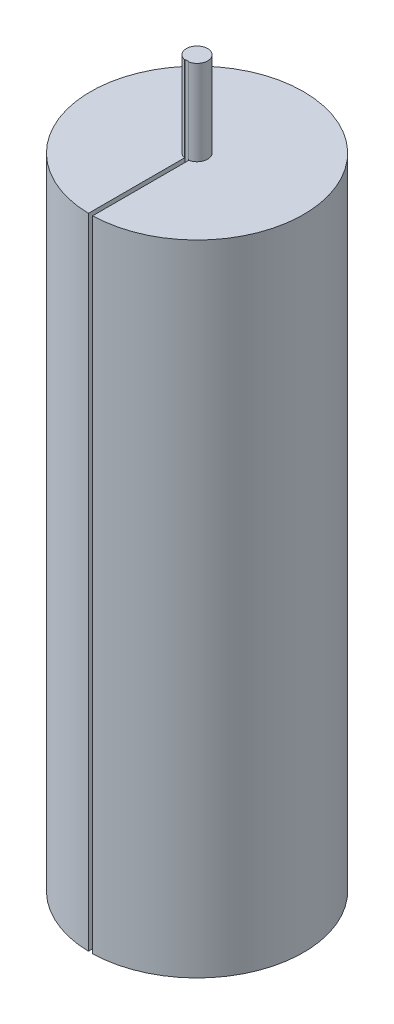
ISO-10303-21;
HEADER;
FILE_DESCRIPTION(('STEP AP214'),'2;1');
FILE_NAME('part.step','',(''),(''),'','','');
FILE_SCHEMA(('AUTOMOTIVE_DESIGN { 1 0 10303 214 1 1 1 1 }'));
ENDSEC;
DATA;
#1=APPLICATION_CONTEXT('core data for automotive mechanical design processes');
#2=APPLICATION_PROTOCOL_DEFINITION('international standard','automotive_design',2000,#1);
#3=PRODUCT_CONTEXT('',#1,'mechanical');
#4=PRODUCT('Part','Part','',(#3));
#5=PRODUCT_RELATED_PRODUCT_CATEGORY('part','',(#4));
#6=PRODUCT_DEFINITION_FORMATION('','',#4);
#7=PRODUCT_DEFINITION_CONTEXT('part definition',#1,'design');
#8=PRODUCT_DEFINITION('design','',#6,#7);
#9=PRODUCT_DEFINITION_SHAPE('','',#8);
#10=(LENGTH_UNIT() NAMED_UNIT(*) SI_UNIT(.MILLI.,.METRE.));
#11=(NAMED_UNIT(*) PLANE_ANGLE_UNIT() SI_UNIT($,.RADIAN.));
#12=(NAMED_UNIT(*) SI_UNIT($,.STERADIAN.) SOLID_ANGLE_UNIT());
#13=UNCERTAINTY_MEASURE_WITH_UNIT(LENGTH_MEASURE(1.E-05),#10,'distance_accuracy_value','');
#14=(GEOMETRIC_REPRESENTATION_CONTEXT(3) GLOBAL_UNCERTAINTY_ASSIGNED_CONTEXT((#13)) GLOBAL_UNIT_ASSIGNED_CONTEXT((#10,
#11,#12)) REPRESENTATION_CONTEXT('',''));
#15=CARTESIAN_POINT('',(0.,0.,0.));
#16=DIRECTION('',(0.,0.,1.));
#17=DIRECTION('',(1.,0.,0.));
#18=AXIS2_PLACEMENT_3D('',#15,#16,#17);
#19=CARTESIAN_POINT('',(0.,150.,0.));
#20=DIRECTION('',(0.,-1.,0.));
#21=DIRECTION('',(0.,0.,-1.));
#22=AXIS2_PLACEMENT_3D('',#19,#20,#21);
#23=CYLINDRICAL_SURFACE('',#22,25.);
#24=CARTESIAN_POINT('',(0.,0.,0.));
#25=DIRECTION('',(0.,1.,0.));
#26=DIRECTION('',(0.,0.,1.));
#27=AXIS2_PLACEMENT_3D('',#24,#25,#26);
#28=CIRCLE('',#27,25.);
#29=CARTESIAN_POINT('',(0.5,0.,24.9949994999));
#30=VERTEX_POINT('',#29);
#31=CARTESIAN_POINT('',(-0.5,0.,24.9949994999));
#32=VERTEX_POINT('',#31);
#33=EDGE_CURVE('E105',#30,#32,#28,.T.);
#34=ORIENTED_EDGE('',*,*,#33,.T.);
#35=DIRECTION('',(0.,-1.,0.));
#36=VECTOR('',#35,1.);
#37=CARTESIAN_POINT('',(-0.5,150.,24.9949994999));
#38=LINE('',#37,#36);
#39=CARTESIAN_POINT('',(-0.5,150.,24.9949994999));
#40=VERTEX_POINT('',#39);
#41=EDGE_CURVE('E110',#32,#40,#38,.F.);
#42=ORIENTED_EDGE('',*,*,#41,.T.);
#43=CARTESIAN_POINT('',(0.,150.,0.));
#44=DIRECTION('',(0.,1.,0.));
#45=DIRECTION('',(0.,0.,1.));
#46=AXIS2_PLACEMENT_3D('',#43,#44,#45);
#47=CIRCLE('',#46,25.);
#48=CARTESIAN_POINT('',(0.5,150.,24.9949994999));
#49=VERTEX_POINT('',#48);
#50=EDGE_CURVE('E39',#49,#40,#47,.T.);
#51=ORIENTED_EDGE('',*,*,#50,.F.);
#52=DIRECTION('',(0.,-1.,0.));
#53=VECTOR('',#52,1.);
#54=CARTESIAN_POINT('',(0.5,150.,24.9949994999));
#55=LINE('',#54,#53);
#56=EDGE_CURVE('E124',#49,#30,#55,.T.);
#57=ORIENTED_EDGE('',*,*,#56,.T.);
#58=EDGE_LOOP('',(#34,#42,#51,#57));
#59=FACE_BOUND('',#58,.T.);
#60=ADVANCED_FACE('F32',(#59),#23,.T.);
#61=CARTESIAN_POINT('',(0.,150.,0.));
#62=DIRECTION('',(0.,1.,0.));
#63=DIRECTION('',(0.,0.,1.));
#64=AXIS2_PLACEMENT_3D('',#61,#62,#63);
#65=PLANE('',#64);
#66=DIRECTION('',(0.,0.,1.));
#67=VECTOR('',#66,1.);
#68=CARTESIAN_POINT('',(-0.499999999999997,150.,0.));
#69=LINE('',#68,#67);
#70=CARTESIAN_POINT('',(-0.499999999999997,150.,2.44948974278318));
#71=VERTEX_POINT('',#70);
#72=EDGE_CURVE('E54',#71,#40,#69,.T.);
#73=ORIENTED_EDGE('',*,*,#72,.F.);
#74=CARTESIAN_POINT('',(0.,150.,0.));
#75=DIRECTION('',(0.,1.,0.));
#76=DIRECTION('',(0.,0.,1.));
#77=AXIS2_PLACEMENT_3D('',#74,#75,#76);
#78=CIRCLE('',#77,2.5);
#79=CARTESIAN_POINT('',(0.499999999999997,150.,2.44948974278318));
#80=VERTEX_POINT('',#79);
#81=EDGE_CURVE('E106',#80,#71,#78,.T.);
#82=ORIENTED_EDGE('',*,*,#81,.F.);
#83=DIRECTION('',(0.,0.,-1.));
#84=VECTOR('',#83,1.);
#85=CARTESIAN_POINT('',(0.499999999999997,150.,0.));
#86=LINE('',#85,#84);
#87=EDGE_CURVE('E121',#49,#80,#86,.T.);
#88=ORIENTED_EDGE('',*,*,#87,.F.);
#89=ORIENTED_EDGE('',*,*,#50,.T.);
#90=EDGE_LOOP('',(#73,#82,#88,#89));
#91=FACE_BOUND('',#90,.T.);
#92=ADVANCED_FACE('F119',(#91),#65,.T.);
#93=CARTESIAN_POINT('',(0.,0.,0.));
#94=DIRECTION('',(0.,1.,0.));
#95=DIRECTION('',(0.,0.,1.));
#96=AXIS2_PLACEMENT_3D('',#93,#94,#95);
#97=PLANE('',#96);
#98=DIRECTION('',(1.,0.,0.));
#99=VECTOR('',#98,1.);
#100=CARTESIAN_POINT('',(-0.499999999999997,0.,2.36196226868541));
#101=LINE('',#100,#99);
#102=CARTESIAN_POINT('',(-0.499999999999997,0.,2.36196226868541));
#103=VERTEX_POINT('',#102);
#104=CARTESIAN_POINT('',(0.499999999999997,0.,2.36196226868541));
#105=VERTEX_POINT('',#104);
#106=EDGE_CURVE('E135',#103,#105,#101,.T.);
#107=ORIENTED_EDGE('',*,*,#106,.F.);
#108=DIRECTION('',(0.,0.,-1.));
#109=VECTOR('',#108,1.);
#110=CARTESIAN_POINT('',(-0.5,0.,28.9877187520488));
#111=LINE('',#110,#109);
#112=EDGE_CURVE('E87',#32,#103,#111,.T.);
#113=ORIENTED_EDGE('',*,*,#112,.F.);
#114=ORIENTED_EDGE('',*,*,#33,.F.);
#115=DIRECTION('',(0.,0.,1.));
#116=VECTOR('',#115,1.);
#117=CARTESIAN_POINT('',(0.5,0.,28.9877187520488));
#118=LINE('',#117,#116);
#119=EDGE_CURVE('E97',#105,#30,#118,.T.);
#120=ORIENTED_EDGE('',*,*,#119,.F.);
#121=EDGE_LOOP('',(#107,#113,#114,#120));
#122=FACE_BOUND('',#121,.T.);
#123=ADVANCED_FACE('F140',(#122),#97,.F.);
#124=CARTESIAN_POINT('',(0.,170.,0.));
#125=DIRECTION('',(0.,-1.,0.));
#126=DIRECTION('',(0.,0.,-1.));
#127=AXIS2_PLACEMENT_3D('',#124,#125,#126);
#128=CYLINDRICAL_SURFACE('',#127,2.5);
#129=ORIENTED_EDGE('',*,*,#81,.T.);
#130=DIRECTION('',(0.,-1.,0.));
#131=VECTOR('',#130,1.);
#132=CARTESIAN_POINT('',(-0.499999999999997,170.,2.44948974278318));
#133=LINE('',#132,#131);
#134=CARTESIAN_POINT('',(-0.499999999999997,170.,2.44948974278318));
#135=VERTEX_POINT('',#134);
#136=EDGE_CURVE('E126',#71,#135,#133,.F.);
#137=ORIENTED_EDGE('',*,*,#136,.T.);
#138=CARTESIAN_POINT('',(0.,170.,0.));
#139=DIRECTION('',(0.,1.,0.));
#140=DIRECTION('',(0.,0.,1.));
#141=AXIS2_PLACEMENT_3D('',#138,#139,#140);
#142=CIRCLE('',#141,2.5);
#143=CARTESIAN_POINT('',(0.499999999999997,170.,2.44948974278318));
#144=VERTEX_POINT('',#143);
#145=EDGE_CURVE('E102',#144,#135,#142,.T.);
#146=ORIENTED_EDGE('',*,*,#145,.F.);
#147=DIRECTION('',(0.,-1.,0.));
#148=VECTOR('',#147,1.);
#149=CARTESIAN_POINT('',(0.499999999999997,170.,2.44948974278318));
#150=LINE('',#149,#148);
#151=EDGE_CURVE('E131',#144,#80,#150,.T.);
#152=ORIENTED_EDGE('',*,*,#151,.T.);
#153=EDGE_LOOP('',(#129,#137,#146,#152));
#154=FACE_BOUND('',#153,.T.);
#155=ADVANCED_FACE('F142',(#154),#128,.T.);
#156=CARTESIAN_POINT('',(0.,170.,0.));
#157=DIRECTION('',(0.,1.,0.));
#158=DIRECTION('',(0.,0.,1.));
#159=AXIS2_PLACEMENT_3D('',#156,#157,#158);
#160=PLANE('',#159);
#161=DIRECTION('',(0.,0.,1.));
#162=VECTOR('',#161,1.);
#163=CARTESIAN_POINT('',(-0.499999999999997,170.,0.));
#164=LINE('',#163,#162);
#165=CARTESIAN_POINT('',(-0.499999999999997,170.,2.36196226868541));
#166=VERTEX_POINT('',#165);
#167=EDGE_CURVE('E11',#166,#135,#164,.T.);
#168=ORIENTED_EDGE('',*,*,#167,.F.);
#169=DIRECTION('',(1.,0.,0.));
#170=VECTOR('',#169,1.);
#171=CARTESIAN_POINT('',(-0.499999999999997,170.,2.36196226868541));
#172=LINE('',#171,#170);
#173=CARTESIAN_POINT('',(0.499999999999997,170.,2.36196226868541));
#174=VERTEX_POINT('',#173);
#175=EDGE_CURVE('E94',#166,#174,#172,.T.);
#176=ORIENTED_EDGE('',*,*,#175,.T.);
#177=DIRECTION('',(0.,0.,1.));
#178=VECTOR('',#177,1.);
#179=CARTESIAN_POINT('',(0.5,170.,28.9877187520488));
#180=LINE('',#179,#178);
#181=EDGE_CURVE('E46',#174,#144,#180,.T.);
#182=ORIENTED_EDGE('',*,*,#181,.T.);
#183=ORIENTED_EDGE('',*,*,#145,.T.);
#184=EDGE_LOOP('',(#168,#176,#182,#183));
#185=FACE_BOUND('',#184,.T.);
#186=ADVANCED_FACE('F100',(#185),#160,.T.);
#187=CARTESIAN_POINT('',(-0.5,170.,28.9877187520488));
#188=DIRECTION('',(-1.,0.,0.));
#189=DIRECTION('',(0.,0.,1.));
#190=AXIS2_PLACEMENT_3D('',#187,#188,#189);
#191=PLANE('',#190);
#192=ORIENTED_EDGE('',*,*,#112,.T.);
#193=DIRECTION('',(0.,-1.,0.));
#194=VECTOR('',#193,1.);
#195=CARTESIAN_POINT('',(-0.499999999999997,170.,2.36196226868541));
#196=LINE('',#195,#194);
#197=EDGE_CURVE('E81',#166,#103,#196,.T.);
#198=ORIENTED_EDGE('',*,*,#197,.F.);
#199=ORIENTED_EDGE('',*,*,#167,.T.);
#200=ORIENTED_EDGE('',*,*,#136,.F.);
#201=ORIENTED_EDGE('',*,*,#72,.T.);
#202=ORIENTED_EDGE('',*,*,#41,.F.);
#203=EDGE_LOOP('',(#192,#198,#199,#200,#201,#202));
#204=FACE_BOUND('',#203,.T.);
#205=ADVANCED_FACE('F83',(#204),#191,.F.);
#206=CARTESIAN_POINT('',(0.5,170.,28.9877187520488));
#207=DIRECTION('',(1.,0.,0.));
#208=DIRECTION('',(0.,0.,-1.));
#209=AXIS2_PLACEMENT_3D('',#206,#207,#208);
#210=PLANE('',#209);
#211=ORIENTED_EDGE('',*,*,#87,.T.);
#212=ORIENTED_EDGE('',*,*,#151,.F.);
#213=ORIENTED_EDGE('',*,*,#181,.F.);
#214=DIRECTION('',(0.,-1.,0.));
#215=VECTOR('',#214,1.);
#216=CARTESIAN_POINT('',(0.499999999999997,170.,2.36196226868541));
#217=LINE('',#216,#215);
#218=EDGE_CURVE('E91',#174,#105,#217,.T.);
#219=ORIENTED_EDGE('',*,*,#218,.T.);
#220=ORIENTED_EDGE('',*,*,#119,.T.);
#221=ORIENTED_EDGE('',*,*,#56,.F.);
#222=EDGE_LOOP('',(#211,#212,#213,#219,#220,#221));
#223=FACE_BOUND('',#222,.T.);
#224=ADVANCED_FACE('F141',(#223),#210,.F.);
#225=CARTESIAN_POINT('',(-0.499999999999997,170.,2.36196226868541));
#226=DIRECTION('',(0.,0.,-1.));
#227=DIRECTION('',(-1.,0.,0.));
#228=AXIS2_PLACEMENT_3D('',#225,#226,#227);
#229=PLANE('',#228);
#230=ORIENTED_EDGE('',*,*,#106,.T.);
#231=ORIENTED_EDGE('',*,*,#218,.F.);
#232=ORIENTED_EDGE('',*,*,#175,.F.);
#233=ORIENTED_EDGE('',*,*,#197,.T.);
#234=EDGE_LOOP('',(#230,#231,#232,#233));
#235=FACE_BOUND('',#234,.T.);
#236=ADVANCED_FACE('F95',(#235),#229,.F.);
#237=CLOSED_SHELL('',(#60,#92,#123,#155,#186,#205,#224,#236));
#238=MANIFOLD_SOLID_BREP('B2',#237);
#239=ADVANCED_BREP_SHAPE_REPRESENTATION('',(#18,#238),#14);
#240=SHAPE_DEFINITION_REPRESENTATION(#9,#239);
ENDSEC;
END-ISO-10303-21;
